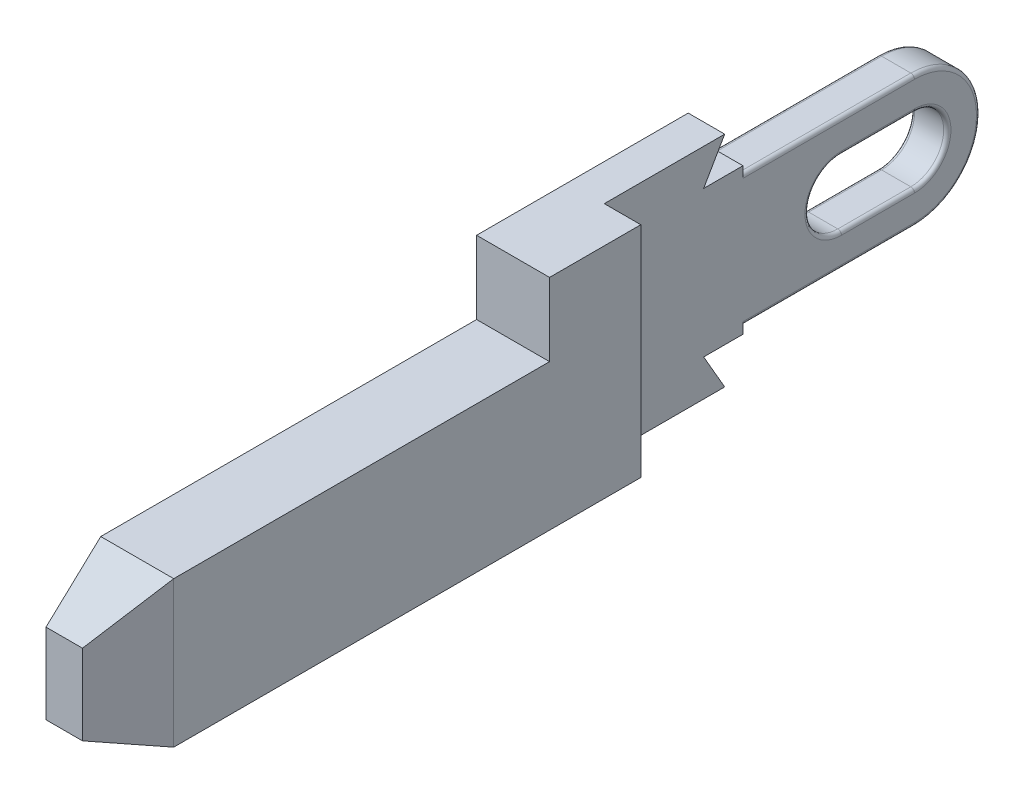
ISO-10303-21;
HEADER;
FILE_DESCRIPTION(('STEP AP214'),'2;1');
FILE_NAME('part.step','',(''),(''),'','','');
FILE_SCHEMA(('AUTOMOTIVE_DESIGN { 1 0 10303 214 1 1 1 1 }'));
ENDSEC;
DATA;
#1=APPLICATION_CONTEXT('core data for automotive mechanical design processes');
#2=APPLICATION_PROTOCOL_DEFINITION('international standard','automotive_design',2000,#1);
#3=PRODUCT_CONTEXT('',#1,'mechanical');
#4=PRODUCT('Part','Part','',(#3));
#5=PRODUCT_RELATED_PRODUCT_CATEGORY('part','',(#4));
#6=PRODUCT_DEFINITION_FORMATION('','',#4);
#7=PRODUCT_DEFINITION_CONTEXT('part definition',#1,'design');
#8=PRODUCT_DEFINITION('design','',#6,#7);
#9=PRODUCT_DEFINITION_SHAPE('','',#8);
#10=(LENGTH_UNIT() NAMED_UNIT(*) SI_UNIT(.MILLI.,.METRE.));
#11=(NAMED_UNIT(*) PLANE_ANGLE_UNIT() SI_UNIT($,.RADIAN.));
#12=(NAMED_UNIT(*) SI_UNIT($,.STERADIAN.) SOLID_ANGLE_UNIT());
#13=UNCERTAINTY_MEASURE_WITH_UNIT(LENGTH_MEASURE(1.E-05),#10,'distance_accuracy_value','');
#14=(GEOMETRIC_REPRESENTATION_CONTEXT(3) GLOBAL_UNCERTAINTY_ASSIGNED_CONTEXT((#13)) GLOBAL_UNIT_ASSIGNED_CONTEXT((#10,
#11,#12)) REPRESENTATION_CONTEXT('',''));
#15=CARTESIAN_POINT('',(0.,0.,0.));
#16=DIRECTION('',(0.,0.,1.));
#17=DIRECTION('',(1.,0.,0.));
#18=AXIS2_PLACEMENT_3D('',#15,#16,#17);
#19=CARTESIAN_POINT('',(2.,-2.,-18.1));
#20=DIRECTION('',(0.,-0.500000000000005,0.866025403784436));
#21=DIRECTION('',(0.,-0.866025403784436,-0.500000000000005));
#22=AXIS2_PLACEMENT_3D('',#19,#20,#21);
#23=PLANE('',#22);
#24=DIRECTION('',(0.,0.866025403784436,0.500000000000005));
#25=VECTOR('',#24,1.);
#26=CARTESIAN_POINT('',(1.,-2.,-18.1));
#27=LINE('',#26,#25);
#28=CARTESIAN_POINT('',(1.,-2.,-18.1));
#29=VERTEX_POINT('',#28);
#30=CARTESIAN_POINT('',(1.,-1.,-17.5226497308104));
#31=VERTEX_POINT('',#30);
#32=EDGE_CURVE('E515',#29,#31,#27,.T.);
#33=ORIENTED_EDGE('',*,*,#32,.F.);
#34=DIRECTION('',(-1.,0.,0.));
#35=VECTOR('',#34,1.);
#36=CARTESIAN_POINT('',(2.,-2.,-18.1));
#37=LINE('',#36,#35);
#38=CARTESIAN_POINT('',(0.,-2.,-18.1));
#39=VERTEX_POINT('',#38);
#40=EDGE_CURVE('E329',#29,#39,#37,.T.);
#41=ORIENTED_EDGE('',*,*,#40,.T.);
#42=DIRECTION('',(0.,0.866025403784436,0.500000000000005));
#43=VECTOR('',#42,1.);
#44=CARTESIAN_POINT('',(0.,-2.,-18.1));
#45=LINE('',#44,#43);
#46=CARTESIAN_POINT('',(0.,-1.,-17.5226497308104));
#47=VERTEX_POINT('',#46);
#48=EDGE_CURVE('E276',#39,#47,#45,.T.);
#49=ORIENTED_EDGE('',*,*,#48,.T.);
#50=DIRECTION('',(-1.,0.,0.));
#51=VECTOR('',#50,1.);
#52=CARTESIAN_POINT('',(2.,-1.,-17.5226497308104));
#53=LINE('',#52,#51);
#54=EDGE_CURVE('E327',#31,#47,#53,.T.);
#55=ORIENTED_EDGE('',*,*,#54,.F.);
#56=EDGE_LOOP('',(#33,#41,#49,#55));
#57=FACE_BOUND('',#56,.T.);
#58=ADVANCED_FACE('F37',(#57),#23,.F.);
#59=CARTESIAN_POINT('',(2.,-1.,-17.5226497308104));
#60=DIRECTION('',(0.,1.,0.));
#61=DIRECTION('',(0.,0.,1.));
#62=AXIS2_PLACEMENT_3D('',#59,#60,#61);
#63=PLANE('',#62);
#64=DIRECTION('',(0.,0.,-1.));
#65=VECTOR('',#64,1.);
#66=CARTESIAN_POINT('',(1.,-1.,-17.5226497308104));
#67=LINE('',#66,#65);
#68=CARTESIAN_POINT('',(1.,-1.,-18.6));
#69=VERTEX_POINT('',#68);
#70=EDGE_CURVE('E513',#31,#69,#67,.T.);
#71=ORIENTED_EDGE('',*,*,#70,.F.);
#72=ORIENTED_EDGE('',*,*,#54,.T.);
#73=DIRECTION('',(0.,0.,-1.));
#74=VECTOR('',#73,1.);
#75=CARTESIAN_POINT('',(0.,-1.,-17.5226497308104));
#76=LINE('',#75,#74);
#77=CARTESIAN_POINT('',(0.,-1.,-18.6));
#78=VERTEX_POINT('',#77);
#79=EDGE_CURVE('E280',#47,#78,#76,.T.);
#80=ORIENTED_EDGE('',*,*,#79,.T.);
#81=DIRECTION('',(-1.,0.,0.));
#82=VECTOR('',#81,1.);
#83=CARTESIAN_POINT('',(2.,-1.,-18.6));
#84=LINE('',#83,#82);
#85=EDGE_CURVE('E325',#69,#78,#84,.T.);
#86=ORIENTED_EDGE('',*,*,#85,.F.);
#87=EDGE_LOOP('',(#71,#72,#80,#86));
#88=FACE_BOUND('',#87,.T.);
#89=ADVANCED_FACE('F578',(#88),#63,.F.);
#90=CARTESIAN_POINT('',(2.,-1.,-18.6));
#91=DIRECTION('',(0.,0.,1.));
#92=DIRECTION('',(1.,0.,0.));
#93=AXIS2_PLACEMENT_3D('',#90,#91,#92);
#94=PLANE('',#93);
#95=DIRECTION('',(0.,1.,0.));
#96=VECTOR('',#95,1.);
#97=CARTESIAN_POINT('',(1.,-1.,-18.6));
#98=LINE('',#97,#96);
#99=CARTESIAN_POINT('',(1.,-0.699999999999999,-18.6));
#100=VERTEX_POINT('',#99);
#101=EDGE_CURVE('E464',#69,#100,#98,.T.);
#102=ORIENTED_EDGE('',*,*,#101,.F.);
#103=ORIENTED_EDGE('',*,*,#85,.T.);
#104=DIRECTION('',(0.,1.,0.));
#105=VECTOR('',#104,1.);
#106=CARTESIAN_POINT('',(0.,-1.,-18.6));
#107=LINE('',#106,#105);
#108=CARTESIAN_POINT('',(0.,-0.699999999999999,-18.6));
#109=VERTEX_POINT('',#108);
#110=EDGE_CURVE('E283',#78,#109,#107,.T.);
#111=ORIENTED_EDGE('',*,*,#110,.T.);
#112=CARTESIAN_POINT('',(0.1,-0.699999999999999,-18.6));
#113=DIRECTION('',(0.,0.,1.));
#114=DIRECTION('',(1.,0.,0.));
#115=AXIS2_PLACEMENT_3D('',#112,#113,#114);
#116=CIRCLE('',#115,0.1);
#117=CARTESIAN_POINT('',(0.1,-0.799999999999999,-18.6));
#118=VERTEX_POINT('',#117);
#119=EDGE_CURVE('E415',#109,#118,#116,.T.);
#120=ORIENTED_EDGE('',*,*,#119,.T.);
#121=DIRECTION('',(-1.,0.,0.));
#122=VECTOR('',#121,1.);
#123=CARTESIAN_POINT('',(2.,-0.799999999999999,-18.6));
#124=LINE('',#123,#122);
#125=CARTESIAN_POINT('',(0.9,-0.799999999999999,-18.6));
#126=VERTEX_POINT('',#125);
#127=EDGE_CURVE('E322',#126,#118,#124,.T.);
#128=ORIENTED_EDGE('',*,*,#127,.F.);
#129=CARTESIAN_POINT('',(0.9,-0.699999999999999,-18.6));
#130=DIRECTION('',(0.,0.,1.));
#131=DIRECTION('',(1.,0.,0.));
#132=AXIS2_PLACEMENT_3D('',#129,#130,#131);
#133=CIRCLE('',#132,0.1);
#134=EDGE_CURVE('E417',#126,#100,#133,.T.);
#135=ORIENTED_EDGE('',*,*,#134,.T.);
#136=EDGE_LOOP('',(#102,#103,#111,#120,#128,#135));
#137=FACE_BOUND('',#136,.T.);
#138=ADVANCED_FACE('F469',(#137),#94,.F.);
#139=CARTESIAN_POINT('',(2.,-0.799999999999999,-18.6));
#140=DIRECTION('',(0.,1.,0.));
#141=DIRECTION('',(0.,0.,1.));
#142=AXIS2_PLACEMENT_3D('',#139,#140,#141);
#143=PLANE('',#142);
#144=ORIENTED_EDGE('',*,*,#127,.T.);
#145=DIRECTION('',(0.,0.,-1.));
#146=VECTOR('',#145,1.);
#147=CARTESIAN_POINT('',(0.1,-0.799999999999999,-23.3));
#148=LINE('',#147,#146);
#149=CARTESIAN_POINT('',(0.1,-0.799999999999999,-23.3));
#150=VERTEX_POINT('',#149);
#151=EDGE_CURVE('E401',#118,#150,#148,.T.);
#152=ORIENTED_EDGE('',*,*,#151,.T.);
#153=DIRECTION('',(-1.,0.,0.));
#154=VECTOR('',#153,1.);
#155=CARTESIAN_POINT('',(2.,-0.799999999999999,-23.3));
#156=LINE('',#155,#154);
#157=CARTESIAN_POINT('',(0.9,-0.799999999999999,-23.3));
#158=VERTEX_POINT('',#157);
#159=EDGE_CURVE('E319',#158,#150,#156,.T.);
#160=ORIENTED_EDGE('',*,*,#159,.F.);
#161=DIRECTION('',(0.,0.,-1.));
#162=VECTOR('',#161,1.);
#163=CARTESIAN_POINT('',(0.9,-0.799999999999999,-18.6));
#164=LINE('',#163,#162);
#165=EDGE_CURVE('E399',#158,#126,#164,.F.);
#166=ORIENTED_EDGE('',*,*,#165,.T.);
#167=EDGE_LOOP('',(#144,#152,#160,#166));
#168=FACE_BOUND('',#167,.T.);
#169=ADVANCED_FACE('F474',(#168),#143,.F.);
#170=CARTESIAN_POINT('',(2.,1.,-23.3));
#171=DIRECTION('',(-1.,0.,0.));
#172=DIRECTION('',(0.,0.,1.));
#173=AXIS2_PLACEMENT_3D('',#170,#171,#172);
#174=CYLINDRICAL_SURFACE('',#173,1.8);
#175=ORIENTED_EDGE('',*,*,#159,.T.);
#176=CARTESIAN_POINT('',(0.1,1.,-23.3));
#177=DIRECTION('',(-1.,0.,0.));
#178=DIRECTION('',(0.,0.,1.));
#179=AXIS2_PLACEMENT_3D('',#176,#177,#178);
#180=CIRCLE('',#179,1.8);
#181=CARTESIAN_POINT('',(0.1,2.8,-23.3));
#182=VERTEX_POINT('',#181);
#183=EDGE_CURVE('E406',#150,#182,#180,.F.);
#184=ORIENTED_EDGE('',*,*,#183,.T.);
#185=DIRECTION('',(-1.,0.,0.));
#186=VECTOR('',#185,1.);
#187=CARTESIAN_POINT('',(2.,2.8,-23.3));
#188=LINE('',#187,#186);
#189=CARTESIAN_POINT('',(0.9,2.8,-23.3));
#190=VERTEX_POINT('',#189);
#191=EDGE_CURVE('E317',#190,#182,#188,.T.);
#192=ORIENTED_EDGE('',*,*,#191,.F.);
#193=CARTESIAN_POINT('',(0.9,1.,-23.3));
#194=DIRECTION('',(1.,0.,0.));
#195=DIRECTION('',(0.,0.,-1.));
#196=AXIS2_PLACEMENT_3D('',#193,#194,#195);
#197=CIRCLE('',#196,1.8);
#198=EDGE_CURVE('E404',#190,#158,#197,.F.);
#199=ORIENTED_EDGE('',*,*,#198,.T.);
#200=EDGE_LOOP('',(#175,#184,#192,#199));
#201=FACE_BOUND('',#200,.T.);
#202=ADVANCED_FACE('F487',(#201),#174,.T.);
#203=CARTESIAN_POINT('',(2.,2.8,-18.6));
#204=DIRECTION('',(0.,-1.,0.));
#205=DIRECTION('',(0.,0.,-1.));
#206=AXIS2_PLACEMENT_3D('',#203,#204,#205);
#207=PLANE('',#206);
#208=ORIENTED_EDGE('',*,*,#191,.T.);
#209=DIRECTION('',(0.,0.,1.));
#210=VECTOR('',#209,1.);
#211=CARTESIAN_POINT('',(0.1,2.8,-18.6));
#212=LINE('',#211,#210);
#213=CARTESIAN_POINT('',(0.1,2.8,-18.6));
#214=VERTEX_POINT('',#213);
#215=EDGE_CURVE('E54',#182,#214,#212,.T.);
#216=ORIENTED_EDGE('',*,*,#215,.T.);
#217=DIRECTION('',(-1.,0.,0.));
#218=VECTOR('',#217,1.);
#219=CARTESIAN_POINT('',(2.,2.8,-18.6));
#220=LINE('',#219,#218);
#221=CARTESIAN_POINT('',(0.9,2.8,-18.6));
#222=VERTEX_POINT('',#221);
#223=EDGE_CURVE('E315',#222,#214,#220,.T.);
#224=ORIENTED_EDGE('',*,*,#223,.F.);
#225=DIRECTION('',(0.,0.,1.));
#226=VECTOR('',#225,1.);
#227=CARTESIAN_POINT('',(0.9,2.8,-23.3));
#228=LINE('',#227,#226);
#229=EDGE_CURVE('E412',#222,#190,#228,.F.);
#230=ORIENTED_EDGE('',*,*,#229,.T.);
#231=EDGE_LOOP('',(#208,#216,#224,#230));
#232=FACE_BOUND('',#231,.T.);
#233=ADVANCED_FACE('F488',(#232),#207,.F.);
#234=CARTESIAN_POINT('',(2.,3.,-18.6));
#235=DIRECTION('',(0.,0.,1.));
#236=DIRECTION('',(1.,0.,0.));
#237=AXIS2_PLACEMENT_3D('',#234,#235,#236);
#238=PLANE('',#237);
#239=DIRECTION('',(0.,1.,0.));
#240=VECTOR('',#239,1.);
#241=CARTESIAN_POINT('',(1.,3.,-18.6));
#242=LINE('',#241,#240);
#243=CARTESIAN_POINT('',(1.,2.7,-18.6));
#244=VERTEX_POINT('',#243);
#245=CARTESIAN_POINT('',(1.,3.,-18.6));
#246=VERTEX_POINT('',#245);
#247=EDGE_CURVE('E461',#244,#246,#242,.T.);
#248=ORIENTED_EDGE('',*,*,#247,.F.);
#249=CARTESIAN_POINT('',(0.9,2.7,-18.6));
#250=DIRECTION('',(0.,0.,1.));
#251=DIRECTION('',(1.,0.,0.));
#252=AXIS2_PLACEMENT_3D('',#249,#250,#251);
#253=CIRCLE('',#252,0.1);
#254=EDGE_CURVE('E11',#244,#222,#253,.T.);
#255=ORIENTED_EDGE('',*,*,#254,.T.);
#256=ORIENTED_EDGE('',*,*,#223,.T.);
#257=CARTESIAN_POINT('',(0.1,2.7,-18.6));
#258=DIRECTION('',(0.,0.,1.));
#259=DIRECTION('',(1.,0.,0.));
#260=AXIS2_PLACEMENT_3D('',#257,#258,#259);
#261=CIRCLE('',#260,0.1);
#262=CARTESIAN_POINT('',(0.,2.7,-18.6));
#263=VERTEX_POINT('',#262);
#264=EDGE_CURVE('E46',#214,#263,#261,.T.);
#265=ORIENTED_EDGE('',*,*,#264,.T.);
#266=DIRECTION('',(0.,1.,0.));
#267=VECTOR('',#266,1.);
#268=CARTESIAN_POINT('',(0.,3.,-18.6));
#269=LINE('',#268,#267);
#270=CARTESIAN_POINT('',(0.,3.,-18.6));
#271=VERTEX_POINT('',#270);
#272=EDGE_CURVE('E285',#263,#271,#269,.T.);
#273=ORIENTED_EDGE('',*,*,#272,.T.);
#274=DIRECTION('',(-1.,0.,0.));
#275=VECTOR('',#274,1.);
#276=CARTESIAN_POINT('',(2.,3.,-18.6));
#277=LINE('',#276,#275);
#278=EDGE_CURVE('E313',#246,#271,#277,.T.);
#279=ORIENTED_EDGE('',*,*,#278,.F.);
#280=EDGE_LOOP('',(#248,#255,#256,#265,#273,#279));
#281=FACE_BOUND('',#280,.T.);
#282=ADVANCED_FACE('F493',(#281),#238,.F.);
#283=CARTESIAN_POINT('',(2.,3.,-17.5226497308104));
#284=DIRECTION('',(0.,-1.,0.));
#285=DIRECTION('',(0.,0.,-1.));
#286=AXIS2_PLACEMENT_3D('',#283,#284,#285);
#287=PLANE('',#286);
#288=DIRECTION('',(0.,0.,1.));
#289=VECTOR('',#288,1.);
#290=CARTESIAN_POINT('',(1.,3.,-17.5226497308104));
#291=LINE('',#290,#289);
#292=CARTESIAN_POINT('',(1.,3.,-17.5226497308104));
#293=VERTEX_POINT('',#292);
#294=EDGE_CURVE('E503',#246,#293,#291,.T.);
#295=ORIENTED_EDGE('',*,*,#294,.F.);
#296=ORIENTED_EDGE('',*,*,#278,.T.);
#297=DIRECTION('',(0.,0.,1.));
#298=VECTOR('',#297,1.);
#299=CARTESIAN_POINT('',(0.,3.,-17.5226497308104));
#300=LINE('',#299,#298);
#301=CARTESIAN_POINT('',(0.,3.,-17.5226497308104));
#302=VERTEX_POINT('',#301);
#303=EDGE_CURVE('E288',#271,#302,#300,.T.);
#304=ORIENTED_EDGE('',*,*,#303,.T.);
#305=DIRECTION('',(-1.,0.,0.));
#306=VECTOR('',#305,1.);
#307=CARTESIAN_POINT('',(2.,3.,-17.5226497308104));
#308=LINE('',#307,#306);
#309=EDGE_CURVE('E311',#293,#302,#308,.T.);
#310=ORIENTED_EDGE('',*,*,#309,.F.);
#311=EDGE_LOOP('',(#295,#296,#304,#310));
#312=FACE_BOUND('',#311,.T.);
#313=ADVANCED_FACE('F502',(#312),#287,.F.);
#314=CARTESIAN_POINT('',(2.,4.,-18.1));
#315=DIRECTION('',(0.,0.500000000000005,0.866025403784436));
#316=DIRECTION('',(0.,-0.866025403784436,0.500000000000005));
#317=AXIS2_PLACEMENT_3D('',#314,#315,#316);
#318=PLANE('',#317);
#319=DIRECTION('',(0.,0.866025403784436,-0.500000000000005));
#320=VECTOR('',#319,1.);
#321=CARTESIAN_POINT('',(1.,4.,-18.1));
#322=LINE('',#321,#320);
#323=CARTESIAN_POINT('',(1.,4.,-18.1));
#324=VERTEX_POINT('',#323);
#325=EDGE_CURVE('E505',#293,#324,#322,.T.);
#326=ORIENTED_EDGE('',*,*,#325,.F.);
#327=ORIENTED_EDGE('',*,*,#309,.T.);
#328=DIRECTION('',(0.,0.866025403784436,-0.500000000000005));
#329=VECTOR('',#328,1.);
#330=CARTESIAN_POINT('',(0.,4.,-18.1));
#331=LINE('',#330,#329);
#332=CARTESIAN_POINT('',(0.,4.,-18.1));
#333=VERTEX_POINT('',#332);
#334=EDGE_CURVE('E291',#302,#333,#331,.T.);
#335=ORIENTED_EDGE('',*,*,#334,.T.);
#336=DIRECTION('',(-1.,0.,0.));
#337=VECTOR('',#336,1.);
#338=CARTESIAN_POINT('',(2.,4.,-18.1));
#339=LINE('',#338,#337);
#340=EDGE_CURVE('E309',#324,#333,#339,.T.);
#341=ORIENTED_EDGE('',*,*,#340,.F.);
#342=EDGE_LOOP('',(#326,#327,#335,#341));
#343=FACE_BOUND('',#342,.T.);
#344=ADVANCED_FACE('F792',(#343),#318,.F.);
#345=CARTESIAN_POINT('',(2.,1.,-21.3));
#346=DIRECTION('',(-1.,0.,0.));
#347=DIRECTION('',(0.,0.,1.));
#348=AXIS2_PLACEMENT_3D('',#345,#346,#347);
#349=CYLINDRICAL_SURFACE('',#348,0.9);
#350=DIRECTION('',(-1.,0.,0.));
#351=VECTOR('',#350,1.);
#352=CARTESIAN_POINT('',(2.,0.100000000000001,-21.3));
#353=LINE('',#352,#351);
#354=CARTESIAN_POINT('',(0.9,0.100000000000001,-21.3));
#355=VERTEX_POINT('',#354);
#356=CARTESIAN_POINT('',(0.1,0.100000000000001,-21.3));
#357=VERTEX_POINT('',#356);
#358=EDGE_CURVE('E277',#355,#357,#353,.T.);
#359=ORIENTED_EDGE('',*,*,#358,.T.);
#360=CARTESIAN_POINT('',(0.1,1.,-21.3));
#361=DIRECTION('',(-1.,0.,0.));
#362=DIRECTION('',(0.,0.,1.));
#363=AXIS2_PLACEMENT_3D('',#360,#361,#362);
#364=CIRCLE('',#363,0.9);
#365=CARTESIAN_POINT('',(0.1,1.9,-21.3));
#366=VERTEX_POINT('',#365);
#367=EDGE_CURVE('E371',#357,#366,#364,.T.);
#368=ORIENTED_EDGE('',*,*,#367,.T.);
#369=DIRECTION('',(-1.,0.,0.));
#370=VECTOR('',#369,1.);
#371=CARTESIAN_POINT('',(2.,1.9,-21.3));
#372=LINE('',#371,#370);
#373=CARTESIAN_POINT('',(0.9,1.9,-21.3));
#374=VERTEX_POINT('',#373);
#375=EDGE_CURVE('E521',#374,#366,#372,.T.);
#376=ORIENTED_EDGE('',*,*,#375,.F.);
#377=CARTESIAN_POINT('',(0.9,1.,-21.3));
#378=DIRECTION('',(1.,0.,0.));
#379=DIRECTION('',(0.,0.,-1.));
#380=AXIS2_PLACEMENT_3D('',#377,#378,#379);
#381=CIRCLE('',#380,0.9);
#382=EDGE_CURVE('E368',#374,#355,#381,.T.);
#383=ORIENTED_EDGE('',*,*,#382,.T.);
#384=EDGE_LOOP('',(#359,#368,#376,#383));
#385=FACE_BOUND('',#384,.T.);
#386=ADVANCED_FACE('F533',(#385),#349,.F.);
#387=CARTESIAN_POINT('',(2.,0.100000000000001,-21.3));
#388=DIRECTION('',(0.,1.,0.));
#389=DIRECTION('',(0.,0.,1.));
#390=AXIS2_PLACEMENT_3D('',#387,#388,#389);
#391=PLANE('',#390);
#392=DIRECTION('',(-1.,0.,0.));
#393=VECTOR('',#392,1.);
#394=CARTESIAN_POINT('',(2.,0.1,-23.3));
#395=LINE('',#394,#393);
#396=CARTESIAN_POINT('',(0.9,0.1,-23.3));
#397=VERTEX_POINT('',#396);
#398=CARTESIAN_POINT('',(0.1,0.1,-23.3));
#399=VERTEX_POINT('',#398);
#400=EDGE_CURVE('E527',#397,#399,#395,.T.);
#401=ORIENTED_EDGE('',*,*,#400,.T.);
#402=DIRECTION('',(0.,0.,-1.));
#403=VECTOR('',#402,1.);
#404=CARTESIAN_POINT('',(0.1,0.100000000000001,-21.3));
#405=LINE('',#404,#403);
#406=EDGE_CURVE('E410',#399,#357,#405,.F.);
#407=ORIENTED_EDGE('',*,*,#406,.T.);
#408=ORIENTED_EDGE('',*,*,#358,.F.);
#409=DIRECTION('',(0.,0.,-1.));
#410=VECTOR('',#409,1.);
#411=CARTESIAN_POINT('',(0.9,0.100000000000001,-21.3));
#412=LINE('',#411,#410);
#413=EDGE_CURVE('E408',#355,#397,#412,.T.);
#414=ORIENTED_EDGE('',*,*,#413,.T.);
#415=EDGE_LOOP('',(#401,#407,#408,#414));
#416=FACE_BOUND('',#415,.T.);
#417=ADVANCED_FACE('F807',(#416),#391,.T.);
#418=CARTESIAN_POINT('',(2.,1.,-23.3));
#419=DIRECTION('',(-1.,0.,0.));
#420=DIRECTION('',(0.,0.,1.));
#421=AXIS2_PLACEMENT_3D('',#418,#419,#420);
#422=CYLINDRICAL_SURFACE('',#421,0.9);
#423=DIRECTION('',(-1.,0.,0.));
#424=VECTOR('',#423,1.);
#425=CARTESIAN_POINT('',(2.,1.9,-23.3));
#426=LINE('',#425,#424);
#427=CARTESIAN_POINT('',(0.9,1.9,-23.3));
#428=VERTEX_POINT('',#427);
#429=CARTESIAN_POINT('',(0.1,1.9,-23.3));
#430=VERTEX_POINT('',#429);
#431=EDGE_CURVE('E524',#428,#430,#426,.T.);
#432=ORIENTED_EDGE('',*,*,#431,.T.);
#433=CARTESIAN_POINT('',(0.1,1.,-23.3));
#434=DIRECTION('',(-1.,0.,0.));
#435=DIRECTION('',(0.,0.,1.));
#436=AXIS2_PLACEMENT_3D('',#433,#434,#435);
#437=CIRCLE('',#436,0.9);
#438=EDGE_CURVE('E380',#430,#399,#437,.T.);
#439=ORIENTED_EDGE('',*,*,#438,.T.);
#440=ORIENTED_EDGE('',*,*,#400,.F.);
#441=CARTESIAN_POINT('',(0.9,1.,-23.3));
#442=DIRECTION('',(1.,0.,0.));
#443=DIRECTION('',(0.,0.,-1.));
#444=AXIS2_PLACEMENT_3D('',#441,#442,#443);
#445=CIRCLE('',#444,0.9);
#446=EDGE_CURVE('E378',#397,#428,#445,.T.);
#447=ORIENTED_EDGE('',*,*,#446,.T.);
#448=EDGE_LOOP('',(#432,#439,#440,#447));
#449=FACE_BOUND('',#448,.T.);
#450=ADVANCED_FACE('F560',(#449),#422,.F.);
#451=CARTESIAN_POINT('',(2.,1.9,-21.3));
#452=DIRECTION('',(0.,-1.,0.));
#453=DIRECTION('',(0.,0.,-1.));
#454=AXIS2_PLACEMENT_3D('',#451,#452,#453);
#455=PLANE('',#454);
#456=ORIENTED_EDGE('',*,*,#375,.T.);
#457=DIRECTION('',(0.,0.,1.));
#458=VECTOR('',#457,1.);
#459=CARTESIAN_POINT('',(0.1,1.9,-21.3));
#460=LINE('',#459,#458);
#461=EDGE_CURVE('E376',#366,#430,#460,.F.);
#462=ORIENTED_EDGE('',*,*,#461,.T.);
#463=ORIENTED_EDGE('',*,*,#431,.F.);
#464=DIRECTION('',(0.,0.,1.));
#465=VECTOR('',#464,1.);
#466=CARTESIAN_POINT('',(0.9,1.9,-21.3));
#467=LINE('',#466,#465);
#468=EDGE_CURVE('E374',#428,#374,#467,.T.);
#469=ORIENTED_EDGE('',*,*,#468,.T.);
#470=EDGE_LOOP('',(#456,#462,#463,#469));
#471=FACE_BOUND('',#470,.T.);
#472=ADVANCED_FACE('F556',(#471),#455,.T.);
#473=CARTESIAN_POINT('',(2.,1.,-23.3));
#474=DIRECTION('',(-1.,0.,0.));
#475=DIRECTION('',(0.,0.,1.));
#476=AXIS2_PLACEMENT_3D('',#473,#474,#475);
#477=PLANE('',#476);
#478=DIRECTION('',(0.,0.,1.));
#479=VECTOR('',#478,1.);
#480=CARTESIAN_POINT('',(2.,2.,-2.));
#481=LINE('',#480,#479);
#482=CARTESIAN_POINT('',(2.,2.,-12.3));
#483=VERTEX_POINT('',#482);
#484=CARTESIAN_POINT('',(2.,2.,-2.));
#485=VERTEX_POINT('',#484);
#486=EDGE_CURVE('E265',#483,#485,#481,.T.);
#487=ORIENTED_EDGE('',*,*,#486,.T.);
#488=DIRECTION('',(0.,-1.,0.));
#489=VECTOR('',#488,1.);
#490=CARTESIAN_POINT('',(2.,1.,-2.00000000000003));
#491=LINE('',#490,#489);
#492=CARTESIAN_POINT('',(2.,-2.,-2.));
#493=VERTEX_POINT('',#492);
#494=EDGE_CURVE('E245',#485,#493,#491,.T.);
#495=ORIENTED_EDGE('',*,*,#494,.T.);
#496=DIRECTION('',(0.,0.,-1.));
#497=VECTOR('',#496,1.);
#498=CARTESIAN_POINT('',(2.,-2.,-2.));
#499=LINE('',#498,#497);
#500=CARTESIAN_POINT('',(2.,-2.,-14.8));
#501=VERTEX_POINT('',#500);
#502=EDGE_CURVE('E256',#493,#501,#499,.T.);
#503=ORIENTED_EDGE('',*,*,#502,.T.);
#504=DIRECTION('',(0.,-1.,0.));
#505=VECTOR('',#504,1.);
#506=CARTESIAN_POINT('',(2.,5.63012774019272,-14.8));
#507=LINE('',#506,#505);
#508=CARTESIAN_POINT('',(2.,4.,-14.8));
#509=VERTEX_POINT('',#508);
#510=EDGE_CURVE('E238',#509,#501,#507,.T.);
#511=ORIENTED_EDGE('',*,*,#510,.F.);
#512=DIRECTION('',(0.,0.,1.));
#513=VECTOR('',#512,1.);
#514=CARTESIAN_POINT('',(2.,4.,-12.3));
#515=LINE('',#514,#513);
#516=CARTESIAN_POINT('',(2.,4.,-12.3));
#517=VERTEX_POINT('',#516);
#518=EDGE_CURVE('E252',#509,#517,#515,.T.);
#519=ORIENTED_EDGE('',*,*,#518,.T.);
#520=DIRECTION('',(0.,-1.,0.));
#521=VECTOR('',#520,1.);
#522=CARTESIAN_POINT('',(2.,2.,-12.3));
#523=LINE('',#522,#521);
#524=EDGE_CURVE('E263',#517,#483,#523,.T.);
#525=ORIENTED_EDGE('',*,*,#524,.T.);
#526=EDGE_LOOP('',(#487,#495,#503,#511,#519,#525));
#527=FACE_BOUND('',#526,.T.);
#528=ADVANCED_FACE('F251',(#527),#477,.F.);
#529=CARTESIAN_POINT('',(0.,1.,-23.3));
#530=DIRECTION('',(-1.,0.,0.));
#531=DIRECTION('',(0.,0.,1.));
#532=AXIS2_PLACEMENT_3D('',#529,#530,#531);
#533=PLANE('',#532);
#534=DIRECTION('',(0.,0.,1.));
#535=VECTOR('',#534,1.);
#536=CARTESIAN_POINT('',(0.,2.,-23.3));
#537=LINE('',#536,#535);
#538=CARTESIAN_POINT('',(0.,2.,-23.3));
#539=VERTEX_POINT('',#538);
#540=CARTESIAN_POINT('',(0.,2.,-21.3));
#541=VERTEX_POINT('',#540);
#542=EDGE_CURVE('E363',#539,#541,#537,.T.);
#543=ORIENTED_EDGE('',*,*,#542,.T.);
#544=CARTESIAN_POINT('',(0.,1.,-21.3));
#545=DIRECTION('',(-1.,0.,0.));
#546=DIRECTION('',(0.,0.,1.));
#547=AXIS2_PLACEMENT_3D('',#544,#545,#546);
#548=CIRCLE('',#547,1.);
#549=CARTESIAN_POINT('',(0.,0.,-21.3));
#550=VERTEX_POINT('',#549);
#551=EDGE_CURVE('E365',#541,#550,#548,.F.);
#552=ORIENTED_EDGE('',*,*,#551,.T.);
#553=DIRECTION('',(0.,0.,-1.));
#554=VECTOR('',#553,1.);
#555=CARTESIAN_POINT('',(0.,0.,-23.3));
#556=LINE('',#555,#554);
#557=CARTESIAN_POINT('',(0.,0.,-23.3));
#558=VERTEX_POINT('',#557);
#559=EDGE_CURVE('E359',#550,#558,#556,.T.);
#560=ORIENTED_EDGE('',*,*,#559,.T.);
#561=CARTESIAN_POINT('',(0.,1.,-23.3));
#562=DIRECTION('',(-1.,0.,0.));
#563=DIRECTION('',(0.,0.,1.));
#564=AXIS2_PLACEMENT_3D('',#561,#562,#563);
#565=CIRCLE('',#564,1.);
#566=EDGE_CURVE('E361',#558,#539,#565,.F.);
#567=ORIENTED_EDGE('',*,*,#566,.T.);
#568=EDGE_LOOP('',(#543,#552,#560,#567));
#569=FACE_BOUND('',#568,.T.);
#570=DIRECTION('',(0.,0.,-1.));
#571=VECTOR('',#570,1.);
#572=CARTESIAN_POINT('',(0.,-0.699999999999999,-18.6));
#573=LINE('',#572,#571);
#574=CARTESIAN_POINT('',(0.,-0.699999999999999,-23.3));
#575=VERTEX_POINT('',#574);
#576=EDGE_CURVE('E356',#575,#109,#573,.F.);
#577=ORIENTED_EDGE('',*,*,#576,.T.);
#578=ORIENTED_EDGE('',*,*,#110,.F.);
#579=ORIENTED_EDGE('',*,*,#79,.F.);
#580=ORIENTED_EDGE('',*,*,#48,.F.);
#581=DIRECTION('',(0.,0.,-1.));
#582=VECTOR('',#581,1.);
#583=CARTESIAN_POINT('',(0.,-2.,-2.));
#584=LINE('',#583,#582);
#585=CARTESIAN_POINT('',(0.,-2.,-2.));
#586=VERTEX_POINT('',#585);
#587=EDGE_CURVE('E273',#586,#39,#584,.T.);
#588=ORIENTED_EDGE('',*,*,#587,.F.);
#589=DIRECTION('',(0.,1.,0.));
#590=VECTOR('',#589,1.);
#591=CARTESIAN_POINT('',(0.,1.1,-2.00000000000003));
#592=LINE('',#591,#590);
#593=CARTESIAN_POINT('',(0.,2.,-2.));
#594=VERTEX_POINT('',#593);
#595=EDGE_CURVE('E348',#586,#594,#592,.T.);
#596=ORIENTED_EDGE('',*,*,#595,.T.);
#597=DIRECTION('',(0.,0.,1.));
#598=VECTOR('',#597,1.);
#599=CARTESIAN_POINT('',(0.,2.,-2.));
#600=LINE('',#599,#598);
#601=CARTESIAN_POINT('',(0.,2.,-12.3));
#602=VERTEX_POINT('',#601);
#603=EDGE_CURVE('E267',#602,#594,#600,.T.);
#604=ORIENTED_EDGE('',*,*,#603,.F.);
#605=DIRECTION('',(0.,-1.,0.));
#606=VECTOR('',#605,1.);
#607=CARTESIAN_POINT('',(0.,2.,-12.3));
#608=LINE('',#607,#606);
#609=CARTESIAN_POINT('',(0.,4.,-12.3));
#610=VERTEX_POINT('',#609);
#611=EDGE_CURVE('E296',#610,#602,#608,.T.);
#612=ORIENTED_EDGE('',*,*,#611,.F.);
#613=DIRECTION('',(0.,0.,1.));
#614=VECTOR('',#613,1.);
#615=CARTESIAN_POINT('',(0.,4.,-12.3));
#616=LINE('',#615,#614);
#617=EDGE_CURVE('E294',#333,#610,#616,.T.);
#618=ORIENTED_EDGE('',*,*,#617,.F.);
#619=ORIENTED_EDGE('',*,*,#334,.F.);
#620=ORIENTED_EDGE('',*,*,#303,.F.);
#621=ORIENTED_EDGE('',*,*,#272,.F.);
#622=DIRECTION('',(0.,0.,1.));
#623=VECTOR('',#622,1.);
#624=CARTESIAN_POINT('',(0.,2.7,-23.3));
#625=LINE('',#624,#623);
#626=CARTESIAN_POINT('',(0.,2.7,-23.3));
#627=VERTEX_POINT('',#626);
#628=EDGE_CURVE('E352',#263,#627,#625,.F.);
#629=ORIENTED_EDGE('',*,*,#628,.T.);
#630=CARTESIAN_POINT('',(0.,1.,-23.3));
#631=DIRECTION('',(-1.,0.,0.));
#632=DIRECTION('',(0.,0.,1.));
#633=AXIS2_PLACEMENT_3D('',#630,#631,#632);
#634=CIRCLE('',#633,1.7);
#635=EDGE_CURVE('E354',#627,#575,#634,.T.);
#636=ORIENTED_EDGE('',*,*,#635,.T.);
#637=EDGE_LOOP('',(#577,#578,#579,#580,#588,#596,#604,#612,#618,#619,#620,#621,#629,#636));
#638=FACE_BOUND('',#637,.T.);
#639=ADVANCED_FACE('F498',(#569,#638),#533,.T.);
#640=CARTESIAN_POINT('',(2.,-1.1,0.));
#641=DIRECTION('',(0.,0.911921505175107,-0.410364677328798));
#642=DIRECTION('',(0.,0.410364677328798,0.911921505175107));
#643=AXIS2_PLACEMENT_3D('',#640,#641,#642);
#644=PLANE('',#643);
#645=DIRECTION('',(-1.,0.,0.));
#646=VECTOR('',#645,1.);
#647=CARTESIAN_POINT('',(2.,-1.1,0.));
#648=LINE('',#647,#646);
#649=CARTESIAN_POINT('',(1.5,-1.1,0.));
#650=VERTEX_POINT('',#649);
#651=CARTESIAN_POINT('',(0.500000000000001,-1.1,0.));
#652=VERTEX_POINT('',#651);
#653=EDGE_CURVE('E246',#650,#652,#648,.T.);
#654=ORIENTED_EDGE('',*,*,#653,.T.);
#655=DIRECTION('',(-0.222277112237191,-0.400098802026949,-0.889108448948775));
#656=VECTOR('',#655,1.);
#657=CARTESIAN_POINT('',(0.597826086956521,-0.923913043478261,0.391304347826088));
#658=LINE('',#657,#656);
#659=EDGE_CURVE('E346',#652,#586,#658,.T.);
#660=ORIENTED_EDGE('',*,*,#659,.T.);
#661=DIRECTION('',(-1.,0.,0.));
#662=VECTOR('',#661,1.);
#663=CARTESIAN_POINT('',(2.,-2.,-2.));
#664=LINE('',#663,#662);
#665=EDGE_CURVE('E331',#493,#586,#664,.T.);
#666=ORIENTED_EDGE('',*,*,#665,.F.);
#667=DIRECTION('',(0.222277112237191,-0.400098802026949,-0.889108448948775));
#668=VECTOR('',#667,1.);
#669=CARTESIAN_POINT('',(1.73320158102767,-1.51976284584981,-0.932806324110698));
#670=LINE('',#669,#668);
#671=EDGE_CURVE('E337',#493,#650,#670,.F.);
#672=ORIENTED_EDGE('',*,*,#671,.T.);
#673=EDGE_LOOP('',(#654,#660,#666,#672));
#674=FACE_BOUND('',#673,.T.);
#675=ADVANCED_FACE('F592',(#674),#644,.F.);
#676=CARTESIAN_POINT('',(2.,-2.,-2.));
#677=DIRECTION('',(0.,1.,0.));
#678=DIRECTION('',(0.,0.,1.));
#679=AXIS2_PLACEMENT_3D('',#676,#677,#678);
#680=PLANE('',#679);
#681=DIRECTION('',(0.,0.,-1.));
#682=VECTOR('',#681,1.);
#683=CARTESIAN_POINT('',(1.,-2.,-2.));
#684=LINE('',#683,#682);
#685=CARTESIAN_POINT('',(1.,-2.,-14.8));
#686=VERTEX_POINT('',#685);
#687=EDGE_CURVE('E517',#686,#29,#684,.T.);
#688=ORIENTED_EDGE('',*,*,#687,.F.);
#689=DIRECTION('',(1.,0.,0.));
#690=VECTOR('',#689,1.);
#691=CARTESIAN_POINT('',(2.,-2.,-14.8));
#692=LINE('',#691,#690);
#693=EDGE_CURVE('E519',#686,#501,#692,.T.);
#694=ORIENTED_EDGE('',*,*,#693,.T.);
#695=ORIENTED_EDGE('',*,*,#502,.F.);
#696=ORIENTED_EDGE('',*,*,#665,.T.);
#697=ORIENTED_EDGE('',*,*,#587,.T.);
#698=ORIENTED_EDGE('',*,*,#40,.F.);
#699=EDGE_LOOP('',(#688,#694,#695,#696,#697,#698));
#700=FACE_BOUND('',#699,.T.);
#701=ADVANCED_FACE('F589',(#700),#680,.F.);
#702=CARTESIAN_POINT('',(2.,4.,-12.3));
#703=DIRECTION('',(0.,-1.,0.));
#704=DIRECTION('',(0.,0.,-1.));
#705=AXIS2_PLACEMENT_3D('',#702,#703,#704);
#706=PLANE('',#705);
#707=ORIENTED_EDGE('',*,*,#518,.F.);
#708=DIRECTION('',(-1.,0.,0.));
#709=VECTOR('',#708,1.);
#710=CARTESIAN_POINT('',(2.,4.,-14.8));
#711=LINE('',#710,#709);
#712=CARTESIAN_POINT('',(1.,4.,-14.8));
#713=VERTEX_POINT('',#712);
#714=EDGE_CURVE('E235',#509,#713,#711,.T.);
#715=ORIENTED_EDGE('',*,*,#714,.T.);
#716=DIRECTION('',(0.,0.,1.));
#717=VECTOR('',#716,1.);
#718=CARTESIAN_POINT('',(1.,4.,-12.3));
#719=LINE('',#718,#717);
#720=EDGE_CURVE('E508',#324,#713,#719,.T.);
#721=ORIENTED_EDGE('',*,*,#720,.F.);
#722=ORIENTED_EDGE('',*,*,#340,.T.);
#723=ORIENTED_EDGE('',*,*,#617,.T.);
#724=DIRECTION('',(-1.,0.,0.));
#725=VECTOR('',#724,1.);
#726=CARTESIAN_POINT('',(2.,4.,-12.3));
#727=LINE('',#726,#725);
#728=EDGE_CURVE('E261',#517,#610,#727,.T.);
#729=ORIENTED_EDGE('',*,*,#728,.F.);
#730=EDGE_LOOP('',(#707,#715,#721,#722,#723,#729));
#731=FACE_BOUND('',#730,.T.);
#732=ADVANCED_FACE('F259',(#731),#706,.F.);
#733=CARTESIAN_POINT('',(2.,2.,-12.3));
#734=DIRECTION('',(0.,0.,-1.));
#735=DIRECTION('',(-1.,0.,0.));
#736=AXIS2_PLACEMENT_3D('',#733,#734,#735);
#737=PLANE('',#736);
#738=ORIENTED_EDGE('',*,*,#611,.T.);
#739=DIRECTION('',(-1.,0.,0.));
#740=VECTOR('',#739,1.);
#741=CARTESIAN_POINT('',(2.,2.,-12.3));
#742=LINE('',#741,#740);
#743=EDGE_CURVE('E305',#483,#602,#742,.T.);
#744=ORIENTED_EDGE('',*,*,#743,.F.);
#745=ORIENTED_EDGE('',*,*,#524,.F.);
#746=ORIENTED_EDGE('',*,*,#728,.T.);
#747=EDGE_LOOP('',(#738,#744,#745,#746));
#748=FACE_BOUND('',#747,.T.);
#749=ADVANCED_FACE('F857',(#748),#737,.F.);
#750=CARTESIAN_POINT('',(2.,2.,-2.));
#751=DIRECTION('',(0.,-1.,0.));
#752=DIRECTION('',(0.,0.,-1.));
#753=AXIS2_PLACEMENT_3D('',#750,#751,#752);
#754=PLANE('',#753);
#755=ORIENTED_EDGE('',*,*,#603,.T.);
#756=DIRECTION('',(-1.,0.,0.));
#757=VECTOR('',#756,1.);
#758=CARTESIAN_POINT('',(2.,2.,-2.));
#759=LINE('',#758,#757);
#760=EDGE_CURVE('E302',#485,#594,#759,.T.);
#761=ORIENTED_EDGE('',*,*,#760,.F.);
#762=ORIENTED_EDGE('',*,*,#486,.F.);
#763=ORIENTED_EDGE('',*,*,#743,.T.);
#764=EDGE_LOOP('',(#755,#761,#762,#763));
#765=FACE_BOUND('',#764,.T.);
#766=ADVANCED_FACE('F847',(#765),#754,.F.);
#767=CARTESIAN_POINT('',(2.,1.1,0.));
#768=DIRECTION('',(0.,-0.911921505175107,-0.410364677328798));
#769=DIRECTION('',(0.,0.410364677328798,-0.911921505175107));
#770=AXIS2_PLACEMENT_3D('',#767,#768,#769);
#771=PLANE('',#770);
#772=ORIENTED_EDGE('',*,*,#760,.T.);
#773=DIRECTION('',(0.222277112237191,-0.400098802026949,0.889108448948775));
#774=VECTOR('',#773,1.);
#775=CARTESIAN_POINT('',(0.597826086956521,0.923913043478261,0.391304347826088));
#776=LINE('',#775,#774);
#777=CARTESIAN_POINT('',(0.500000000000001,1.1,0.));
#778=VERTEX_POINT('',#777);
#779=EDGE_CURVE('E350',#594,#778,#776,.T.);
#780=ORIENTED_EDGE('',*,*,#779,.T.);
#781=DIRECTION('',(-1.,0.,0.));
#782=VECTOR('',#781,1.);
#783=CARTESIAN_POINT('',(2.,1.1,0.));
#784=LINE('',#783,#782);
#785=CARTESIAN_POINT('',(1.5,1.1,0.));
#786=VERTEX_POINT('',#785);
#787=EDGE_CURVE('E272',#786,#778,#784,.T.);
#788=ORIENTED_EDGE('',*,*,#787,.F.);
#789=DIRECTION('',(-0.222277112237191,-0.400098802026949,0.889108448948775));
#790=VECTOR('',#789,1.);
#791=CARTESIAN_POINT('',(1.91106719367589,1.83992094861661,-1.64426877470358));
#792=LINE('',#791,#790);
#793=EDGE_CURVE('E341',#786,#485,#792,.F.);
#794=ORIENTED_EDGE('',*,*,#793,.T.);
#795=EDGE_LOOP('',(#772,#780,#788,#794));
#796=FACE_BOUND('',#795,.T.);
#797=ADVANCED_FACE('F835',(#796),#771,.F.);
#798=CARTESIAN_POINT('',(2.,0.,0.));
#799=DIRECTION('',(0.,0.,-1.));
#800=DIRECTION('',(-1.,0.,0.));
#801=AXIS2_PLACEMENT_3D('',#798,#799,#800);
#802=PLANE('',#801);
#803=ORIENTED_EDGE('',*,*,#787,.T.);
#804=DIRECTION('',(0.,-1.,0.));
#805=VECTOR('',#804,1.);
#806=CARTESIAN_POINT('',(0.5,-1.1,0.));
#807=LINE('',#806,#805);
#808=EDGE_CURVE('E343',#778,#652,#807,.T.);
#809=ORIENTED_EDGE('',*,*,#808,.T.);
#810=ORIENTED_EDGE('',*,*,#653,.F.);
#811=DIRECTION('',(0.,1.,0.));
#812=VECTOR('',#811,1.);
#813=CARTESIAN_POINT('',(1.5,0.,0.));
#814=LINE('',#813,#812);
#815=EDGE_CURVE('E339',#650,#786,#814,.T.);
#816=ORIENTED_EDGE('',*,*,#815,.T.);
#817=EDGE_LOOP('',(#803,#809,#810,#816));
#818=FACE_BOUND('',#817,.T.);
#819=ADVANCED_FACE('F739',(#818),#802,.F.);
#820=CARTESIAN_POINT('',(1.,5.63012774019272,-14.8));
#821=DIRECTION('',(0.,0.,1.));
#822=DIRECTION('',(0.,-1.,0.));
#823=AXIS2_PLACEMENT_3D('',#820,#821,#822);
#824=PLANE('',#823);
#825=DIRECTION('',(0.,-1.,0.));
#826=VECTOR('',#825,1.);
#827=CARTESIAN_POINT('',(1.,5.63012774019272,-14.8));
#828=LINE('',#827,#826);
#829=EDGE_CURVE('E241',#713,#686,#828,.T.);
#830=ORIENTED_EDGE('',*,*,#829,.F.);
#831=ORIENTED_EDGE('',*,*,#714,.F.);
#832=ORIENTED_EDGE('',*,*,#510,.T.);
#833=ORIENTED_EDGE('',*,*,#693,.F.);
#834=EDGE_LOOP('',(#830,#831,#832,#833));
#835=FACE_BOUND('',#834,.T.);
#836=ADVANCED_FACE('F237',(#835),#824,.F.);
#837=CARTESIAN_POINT('',(1.,0.,0.));
#838=DIRECTION('',(1.,0.,0.));
#839=DIRECTION('',(0.,0.,-1.));
#840=AXIS2_PLACEMENT_3D('',#837,#838,#839);
#841=PLANE('',#840);
#842=DIRECTION('',(0.,0.,-1.));
#843=VECTOR('',#842,1.);
#844=CARTESIAN_POINT('',(1.,0.,0.));
#845=LINE('',#844,#843);
#846=CARTESIAN_POINT('',(1.,0.,-23.3));
#847=VERTEX_POINT('',#846);
#848=CARTESIAN_POINT('',(1.,0.,-21.3));
#849=VERTEX_POINT('',#848);
#850=EDGE_CURVE('E390',#847,#849,#845,.F.);
#851=ORIENTED_EDGE('',*,*,#850,.T.);
#852=CARTESIAN_POINT('',(1.,1.,-21.3));
#853=DIRECTION('',(1.,0.,0.));
#854=DIRECTION('',(0.,0.,-1.));
#855=AXIS2_PLACEMENT_3D('',#852,#853,#854);
#856=CIRCLE('',#855,1.);
#857=CARTESIAN_POINT('',(1.,2.,-21.3));
#858=VERTEX_POINT('',#857);
#859=EDGE_CURVE('E396',#849,#858,#856,.F.);
#860=ORIENTED_EDGE('',*,*,#859,.T.);
#861=DIRECTION('',(0.,0.,1.));
#862=VECTOR('',#861,1.);
#863=CARTESIAN_POINT('',(1.,1.99999999999999,0.));
#864=LINE('',#863,#862);
#865=CARTESIAN_POINT('',(1.,2.,-23.3));
#866=VERTEX_POINT('',#865);
#867=EDGE_CURVE('E394',#858,#866,#864,.F.);
#868=ORIENTED_EDGE('',*,*,#867,.T.);
#869=CARTESIAN_POINT('',(1.,1.,-23.3));
#870=DIRECTION('',(1.,0.,0.));
#871=DIRECTION('',(0.,0.,-1.));
#872=AXIS2_PLACEMENT_3D('',#869,#870,#871);
#873=CIRCLE('',#872,1.);
#874=EDGE_CURVE('E392',#866,#847,#873,.F.);
#875=ORIENTED_EDGE('',*,*,#874,.T.);
#876=EDGE_LOOP('',(#851,#860,#868,#875));
#877=FACE_BOUND('',#876,.T.);
#878=ORIENTED_EDGE('',*,*,#101,.T.);
#879=DIRECTION('',(0.,0.,-1.));
#880=VECTOR('',#879,1.);
#881=CARTESIAN_POINT('',(1.,-0.699999999999999,-23.3));
#882=LINE('',#881,#880);
#883=CARTESIAN_POINT('',(1.,-0.699999999999999,-23.3));
#884=VERTEX_POINT('',#883);
#885=EDGE_CURVE('E387',#100,#884,#882,.T.);
#886=ORIENTED_EDGE('',*,*,#885,.T.);
#887=CARTESIAN_POINT('',(1.,1.,-23.3));
#888=DIRECTION('',(1.,0.,0.));
#889=DIRECTION('',(0.,0.,-1.));
#890=AXIS2_PLACEMENT_3D('',#887,#888,#889);
#891=CIRCLE('',#890,1.7);
#892=CARTESIAN_POINT('',(1.,2.7,-23.3));
#893=VERTEX_POINT('',#892);
#894=EDGE_CURVE('E385',#884,#893,#891,.T.);
#895=ORIENTED_EDGE('',*,*,#894,.T.);
#896=DIRECTION('',(0.,0.,1.));
#897=VECTOR('',#896,1.);
#898=CARTESIAN_POINT('',(1.,2.7,-18.6));
#899=LINE('',#898,#897);
#900=EDGE_CURVE('E382',#893,#244,#899,.T.);
#901=ORIENTED_EDGE('',*,*,#900,.T.);
#902=ORIENTED_EDGE('',*,*,#247,.T.);
#903=ORIENTED_EDGE('',*,*,#294,.T.);
#904=ORIENTED_EDGE('',*,*,#325,.T.);
#905=ORIENTED_EDGE('',*,*,#720,.T.);
#906=ORIENTED_EDGE('',*,*,#829,.T.);
#907=ORIENTED_EDGE('',*,*,#687,.T.);
#908=ORIENTED_EDGE('',*,*,#32,.T.);
#909=ORIENTED_EDGE('',*,*,#70,.T.);
#910=EDGE_LOOP('',(#878,#886,#895,#901,#902,#903,#904,#905,#906,#907,#908,#909));
#911=FACE_BOUND('',#910,.T.);
#912=ADVANCED_FACE('F460',(#877,#911),#841,.T.);
#913=CARTESIAN_POINT('',(2.,1.,-2.00000000000003));
#914=DIRECTION('',(-0.970142500145333,0.,-0.24253562503633));
#915=DIRECTION('',(0.,-1.,0.));
#916=AXIS2_PLACEMENT_3D('',#913,#914,#915);
#917=PLANE('',#916);
#918=ORIENTED_EDGE('',*,*,#793,.F.);
#919=ORIENTED_EDGE('',*,*,#815,.F.);
#920=ORIENTED_EDGE('',*,*,#671,.F.);
#921=ORIENTED_EDGE('',*,*,#494,.F.);
#922=EDGE_LOOP('',(#918,#919,#920,#921));
#923=FACE_BOUND('',#922,.T.);
#924=ADVANCED_FACE('F573',(#923),#917,.F.);
#925=CARTESIAN_POINT('',(0.5,0.,0.));
#926=DIRECTION('',(-0.970142500145333,0.,0.24253562503633));
#927=DIRECTION('',(0.,1.,0.));
#928=AXIS2_PLACEMENT_3D('',#925,#926,#927);
#929=PLANE('',#928);
#930=ORIENTED_EDGE('',*,*,#779,.F.);
#931=ORIENTED_EDGE('',*,*,#595,.F.);
#932=ORIENTED_EDGE('',*,*,#659,.F.);
#933=ORIENTED_EDGE('',*,*,#808,.F.);
#934=EDGE_LOOP('',(#930,#931,#932,#933));
#935=FACE_BOUND('',#934,.T.);
#936=ADVANCED_FACE('F566',(#935),#929,.T.);
#937=CARTESIAN_POINT('',(0.1,1.,-23.3));
#938=DIRECTION('',(-1.,0.,0.));
#939=DIRECTION('',(0.,0.,1.));
#940=AXIS2_PLACEMENT_3D('',#937,#938,#939);
#941=TOROIDAL_SURFACE('',#940,1.,0.1);
#942=CARTESIAN_POINT('',(0.1,0.,-23.3));
#943=DIRECTION('',(0.,0.,1.));
#944=DIRECTION('',(1.,0.,0.));
#945=AXIS2_PLACEMENT_3D('',#942,#943,#944);
#946=CIRCLE('',#945,0.1);
#947=EDGE_CURVE('E427',#399,#558,#946,.T.);
#948=ORIENTED_EDGE('',*,*,#947,.F.);
#949=ORIENTED_EDGE('',*,*,#438,.F.);
#950=CARTESIAN_POINT('',(0.1,2.,-23.3));
#951=DIRECTION('',(0.,0.,1.));
#952=DIRECTION('',(1.,0.,0.));
#953=AXIS2_PLACEMENT_3D('',#950,#951,#952);
#954=CIRCLE('',#953,0.1);
#955=EDGE_CURVE('E257',#539,#430,#954,.T.);
#956=ORIENTED_EDGE('',*,*,#955,.F.);
#957=ORIENTED_EDGE('',*,*,#566,.F.);
#958=EDGE_LOOP('',(#948,#949,#956,#957));
#959=FACE_BOUND('',#958,.T.);
#960=ADVANCED_FACE('F564',(#959),#941,.T.);
#961=CARTESIAN_POINT('',(0.1,2.,-23.3));
#962=DIRECTION('',(0.,0.,1.));
#963=DIRECTION('',(0.,-1.,0.));
#964=AXIS2_PLACEMENT_3D('',#961,#962,#963);
#965=CYLINDRICAL_SURFACE('',#964,0.1);
#966=ORIENTED_EDGE('',*,*,#955,.T.);
#967=ORIENTED_EDGE('',*,*,#461,.F.);
#968=CARTESIAN_POINT('',(0.1,2.,-21.3));
#969=DIRECTION('',(0.,0.,1.));
#970=DIRECTION('',(1.,0.,0.));
#971=AXIS2_PLACEMENT_3D('',#968,#969,#970);
#972=CIRCLE('',#971,0.1);
#973=EDGE_CURVE('E424',#541,#366,#972,.T.);
#974=ORIENTED_EDGE('',*,*,#973,.F.);
#975=ORIENTED_EDGE('',*,*,#542,.F.);
#976=EDGE_LOOP('',(#966,#967,#974,#975));
#977=FACE_BOUND('',#976,.T.);
#978=ADVANCED_FACE('F553',(#977),#965,.T.);
#979=CARTESIAN_POINT('',(0.1,0.,-23.3));
#980=DIRECTION('',(0.,0.,-1.));
#981=DIRECTION('',(0.,1.,0.));
#982=AXIS2_PLACEMENT_3D('',#979,#980,#981);
#983=CYLINDRICAL_SURFACE('',#982,0.1);
#984=ORIENTED_EDGE('',*,*,#947,.T.);
#985=ORIENTED_EDGE('',*,*,#559,.F.);
#986=CARTESIAN_POINT('',(0.1,0.,-21.3));
#987=DIRECTION('',(0.,0.,1.));
#988=DIRECTION('',(1.,0.,0.));
#989=AXIS2_PLACEMENT_3D('',#986,#987,#988);
#990=CIRCLE('',#989,0.1);
#991=EDGE_CURVE('E422',#357,#550,#990,.T.);
#992=ORIENTED_EDGE('',*,*,#991,.F.);
#993=ORIENTED_EDGE('',*,*,#406,.F.);
#994=EDGE_LOOP('',(#984,#985,#992,#993));
#995=FACE_BOUND('',#994,.T.);
#996=ADVANCED_FACE('F546',(#995),#983,.T.);
#997=CARTESIAN_POINT('',(0.1,1.,-21.3));
#998=DIRECTION('',(-1.,0.,0.));
#999=DIRECTION('',(0.,0.,1.));
#1000=AXIS2_PLACEMENT_3D('',#997,#998,#999);
#1001=TOROIDAL_SURFACE('',#1000,1.,0.1);
#1002=ORIENTED_EDGE('',*,*,#973,.T.);
#1003=ORIENTED_EDGE('',*,*,#367,.F.);
#1004=ORIENTED_EDGE('',*,*,#991,.T.);
#1005=ORIENTED_EDGE('',*,*,#551,.F.);
#1006=EDGE_LOOP('',(#1002,#1003,#1004,#1005));
#1007=FACE_BOUND('',#1006,.T.);
#1008=ADVANCED_FACE('F539',(#1007),#1001,.T.);
#1009=CARTESIAN_POINT('',(0.9,1.,-23.3));
#1010=DIRECTION('',(1.,0.,0.));
#1011=DIRECTION('',(0.,0.,-1.));
#1012=AXIS2_PLACEMENT_3D('',#1009,#1010,#1011);
#1013=TOROIDAL_SURFACE('',#1012,1.,0.1);
#1014=CARTESIAN_POINT('',(0.9,0.,-23.3));
#1015=DIRECTION('',(0.,0.,1.));
#1016=DIRECTION('',(1.,0.,0.));
#1017=AXIS2_PLACEMENT_3D('',#1014,#1015,#1016);
#1018=CIRCLE('',#1017,0.1);
#1019=EDGE_CURVE('E437',#847,#397,#1018,.T.);
#1020=ORIENTED_EDGE('',*,*,#1019,.F.);
#1021=ORIENTED_EDGE('',*,*,#874,.F.);
#1022=CARTESIAN_POINT('',(0.9,2.,-23.3));
#1023=DIRECTION('',(0.,0.,1.));
#1024=DIRECTION('',(1.,0.,0.));
#1025=AXIS2_PLACEMENT_3D('',#1022,#1023,#1024);
#1026=CIRCLE('',#1025,0.1);
#1027=EDGE_CURVE('E425',#428,#866,#1026,.T.);
#1028=ORIENTED_EDGE('',*,*,#1027,.F.);
#1029=ORIENTED_EDGE('',*,*,#446,.F.);
#1030=EDGE_LOOP('',(#1020,#1021,#1028,#1029));
#1031=FACE_BOUND('',#1030,.T.);
#1032=ADVANCED_FACE('F602',(#1031),#1013,.T.);
#1033=CARTESIAN_POINT('',(0.9,2.,-21.3));
#1034=DIRECTION('',(0.,0.,1.));
#1035=DIRECTION('',(0.,-1.,0.));
#1036=AXIS2_PLACEMENT_3D('',#1033,#1034,#1035);
#1037=CYLINDRICAL_SURFACE('',#1036,0.1);
#1038=ORIENTED_EDGE('',*,*,#1027,.T.);
#1039=ORIENTED_EDGE('',*,*,#867,.F.);
#1040=CARTESIAN_POINT('',(0.9,2.,-21.3));
#1041=DIRECTION('',(0.,0.,1.));
#1042=DIRECTION('',(1.,0.,0.));
#1043=AXIS2_PLACEMENT_3D('',#1040,#1041,#1042);
#1044=CIRCLE('',#1043,0.1);
#1045=EDGE_CURVE('E434',#374,#858,#1044,.T.);
#1046=ORIENTED_EDGE('',*,*,#1045,.F.);
#1047=ORIENTED_EDGE('',*,*,#468,.F.);
#1048=EDGE_LOOP('',(#1038,#1039,#1046,#1047));
#1049=FACE_BOUND('',#1048,.T.);
#1050=ADVANCED_FACE('F618',(#1049),#1037,.T.);
#1051=CARTESIAN_POINT('',(0.9,0.,-21.3));
#1052=DIRECTION('',(0.,0.,-1.));
#1053=DIRECTION('',(0.,1.,0.));
#1054=AXIS2_PLACEMENT_3D('',#1051,#1052,#1053);
#1055=CYLINDRICAL_SURFACE('',#1054,0.1);
#1056=ORIENTED_EDGE('',*,*,#1019,.T.);
#1057=ORIENTED_EDGE('',*,*,#413,.F.);
#1058=CARTESIAN_POINT('',(0.9,0.,-21.3));
#1059=DIRECTION('',(0.,0.,1.));
#1060=DIRECTION('',(1.,0.,0.));
#1061=AXIS2_PLACEMENT_3D('',#1058,#1059,#1060);
#1062=CIRCLE('',#1061,0.1);
#1063=EDGE_CURVE('E432',#849,#355,#1062,.T.);
#1064=ORIENTED_EDGE('',*,*,#1063,.F.);
#1065=ORIENTED_EDGE('',*,*,#850,.F.);
#1066=EDGE_LOOP('',(#1056,#1057,#1064,#1065));
#1067=FACE_BOUND('',#1066,.T.);
#1068=ADVANCED_FACE('F626',(#1067),#1055,.T.);
#1069=CARTESIAN_POINT('',(0.9,1.,-21.3));
#1070=DIRECTION('',(1.,0.,0.));
#1071=DIRECTION('',(0.,0.,-1.));
#1072=AXIS2_PLACEMENT_3D('',#1069,#1070,#1071);
#1073=TOROIDAL_SURFACE('',#1072,1.,0.1);
#1074=ORIENTED_EDGE('',*,*,#1045,.T.);
#1075=ORIENTED_EDGE('',*,*,#859,.F.);
#1076=ORIENTED_EDGE('',*,*,#1063,.T.);
#1077=ORIENTED_EDGE('',*,*,#382,.F.);
#1078=EDGE_LOOP('',(#1074,#1075,#1076,#1077));
#1079=FACE_BOUND('',#1078,.T.);
#1080=ADVANCED_FACE('F634',(#1079),#1073,.T.);
#1081=CARTESIAN_POINT('',(0.1,2.7,-18.6));
#1082=DIRECTION('',(0.,0.,-1.));
#1083=DIRECTION('',(-1.,0.,0.));
#1084=AXIS2_PLACEMENT_3D('',#1081,#1082,#1083);
#1085=CYLINDRICAL_SURFACE('',#1084,0.1);
#1086=ORIENTED_EDGE('',*,*,#264,.F.);
#1087=ORIENTED_EDGE('',*,*,#215,.F.);
#1088=CARTESIAN_POINT('',(0.1,2.7,-23.3));
#1089=DIRECTION('',(0.,0.,-1.));
#1090=DIRECTION('',(-1.,0.,0.));
#1091=AXIS2_PLACEMENT_3D('',#1088,#1089,#1090);
#1092=CIRCLE('',#1091,0.1);
#1093=EDGE_CURVE('E435',#627,#182,#1092,.T.);
#1094=ORIENTED_EDGE('',*,*,#1093,.F.);
#1095=ORIENTED_EDGE('',*,*,#628,.F.);
#1096=EDGE_LOOP('',(#1086,#1087,#1094,#1095));
#1097=FACE_BOUND('',#1096,.T.);
#1098=ADVANCED_FACE('F491',(#1097),#1085,.T.);
#1099=CARTESIAN_POINT('',(0.1,1.,-23.3));
#1100=DIRECTION('',(-1.,0.,0.));
#1101=DIRECTION('',(0.,0.,1.));
#1102=AXIS2_PLACEMENT_3D('',#1099,#1100,#1101);
#1103=TOROIDAL_SURFACE('',#1102,1.7,0.1);
#1104=ORIENTED_EDGE('',*,*,#1093,.T.);
#1105=ORIENTED_EDGE('',*,*,#183,.F.);
#1106=CARTESIAN_POINT('',(0.1,-0.699999999999999,-23.3));
#1107=DIRECTION('',(0.,0.,1.));
#1108=DIRECTION('',(1.,0.,0.));
#1109=AXIS2_PLACEMENT_3D('',#1106,#1107,#1108);
#1110=CIRCLE('',#1109,0.1);
#1111=EDGE_CURVE('E442',#575,#150,#1110,.T.);
#1112=ORIENTED_EDGE('',*,*,#1111,.F.);
#1113=ORIENTED_EDGE('',*,*,#635,.F.);
#1114=EDGE_LOOP('',(#1104,#1105,#1112,#1113));
#1115=FACE_BOUND('',#1114,.T.);
#1116=ADVANCED_FACE('F483',(#1115),#1103,.T.);
#1117=CARTESIAN_POINT('',(0.1,-0.699999999999999,-18.6));
#1118=DIRECTION('',(0.,0.,1.));
#1119=DIRECTION('',(1.,0.,0.));
#1120=AXIS2_PLACEMENT_3D('',#1117,#1118,#1119);
#1121=CYLINDRICAL_SURFACE('',#1120,0.1);
#1122=ORIENTED_EDGE('',*,*,#119,.F.);
#1123=ORIENTED_EDGE('',*,*,#576,.F.);
#1124=ORIENTED_EDGE('',*,*,#1111,.T.);
#1125=ORIENTED_EDGE('',*,*,#151,.F.);
#1126=EDGE_LOOP('',(#1122,#1123,#1124,#1125));
#1127=FACE_BOUND('',#1126,.T.);
#1128=ADVANCED_FACE('F477',(#1127),#1121,.T.);
#1129=CARTESIAN_POINT('',(0.9,2.7,0.));
#1130=DIRECTION('',(0.,0.,-1.));
#1131=DIRECTION('',(-1.,0.,0.));
#1132=AXIS2_PLACEMENT_3D('',#1129,#1130,#1131);
#1133=CYLINDRICAL_SURFACE('',#1132,0.1);
#1134=ORIENTED_EDGE('',*,*,#254,.F.);
#1135=ORIENTED_EDGE('',*,*,#900,.F.);
#1136=CARTESIAN_POINT('',(0.9,2.7,-23.3));
#1137=DIRECTION('',(0.,0.,-1.));
#1138=DIRECTION('',(-1.,0.,0.));
#1139=AXIS2_PLACEMENT_3D('',#1136,#1137,#1138);
#1140=CIRCLE('',#1139,0.1);
#1141=EDGE_CURVE('E41',#190,#893,#1140,.T.);
#1142=ORIENTED_EDGE('',*,*,#1141,.F.);
#1143=ORIENTED_EDGE('',*,*,#229,.F.);
#1144=EDGE_LOOP('',(#1134,#1135,#1142,#1143));
#1145=FACE_BOUND('',#1144,.T.);
#1146=ADVANCED_FACE('F39',(#1145),#1133,.T.);
#1147=CARTESIAN_POINT('',(0.9,1.,-23.3));
#1148=DIRECTION('',(1.,0.,0.));
#1149=DIRECTION('',(0.,0.,-1.));
#1150=AXIS2_PLACEMENT_3D('',#1147,#1148,#1149);
#1151=TOROIDAL_SURFACE('',#1150,1.7,0.1);
#1152=ORIENTED_EDGE('',*,*,#1141,.T.);
#1153=ORIENTED_EDGE('',*,*,#894,.F.);
#1154=CARTESIAN_POINT('',(0.9,-0.699999999999999,-23.3));
#1155=DIRECTION('',(0.,0.,1.));
#1156=DIRECTION('',(1.,0.,0.));
#1157=AXIS2_PLACEMENT_3D('',#1154,#1155,#1156);
#1158=CIRCLE('',#1157,0.1);
#1159=EDGE_CURVE('E445',#158,#884,#1158,.T.);
#1160=ORIENTED_EDGE('',*,*,#1159,.F.);
#1161=ORIENTED_EDGE('',*,*,#198,.F.);
#1162=EDGE_LOOP('',(#1152,#1153,#1160,#1161));
#1163=FACE_BOUND('',#1162,.T.);
#1164=ADVANCED_FACE('F455',(#1163),#1151,.T.);
#1165=CARTESIAN_POINT('',(0.9,-0.699999999999999,0.));
#1166=DIRECTION('',(0.,0.,1.));
#1167=DIRECTION('',(1.,0.,0.));
#1168=AXIS2_PLACEMENT_3D('',#1165,#1166,#1167);
#1169=CYLINDRICAL_SURFACE('',#1168,0.1);
#1170=ORIENTED_EDGE('',*,*,#134,.F.);
#1171=ORIENTED_EDGE('',*,*,#165,.F.);
#1172=ORIENTED_EDGE('',*,*,#1159,.T.);
#1173=ORIENTED_EDGE('',*,*,#885,.F.);
#1174=EDGE_LOOP('',(#1170,#1171,#1172,#1173));
#1175=FACE_BOUND('',#1174,.T.);
#1176=ADVANCED_FACE('F466',(#1175),#1169,.T.);
#1177=CLOSED_SHELL('',(#58,#89,#138,#169,#202,#233,#282,#313,#344,#386,#417,#450,#472,#528,#639,
#675,#701,#732,#749,#766,#797,#819,#836,#912,#924,#936,#960,#978,#996,#1008,#1032,#1050,#1068,
#1080,#1098,#1116,#1128,#1146,#1164,#1176));
#1178=MANIFOLD_SOLID_BREP('B2',#1177);
#1179=ADVANCED_BREP_SHAPE_REPRESENTATION('',(#18,#1178),#14);
#1180=SHAPE_DEFINITION_REPRESENTATION(#9,#1179);
ENDSEC;
END-ISO-10303-21;
